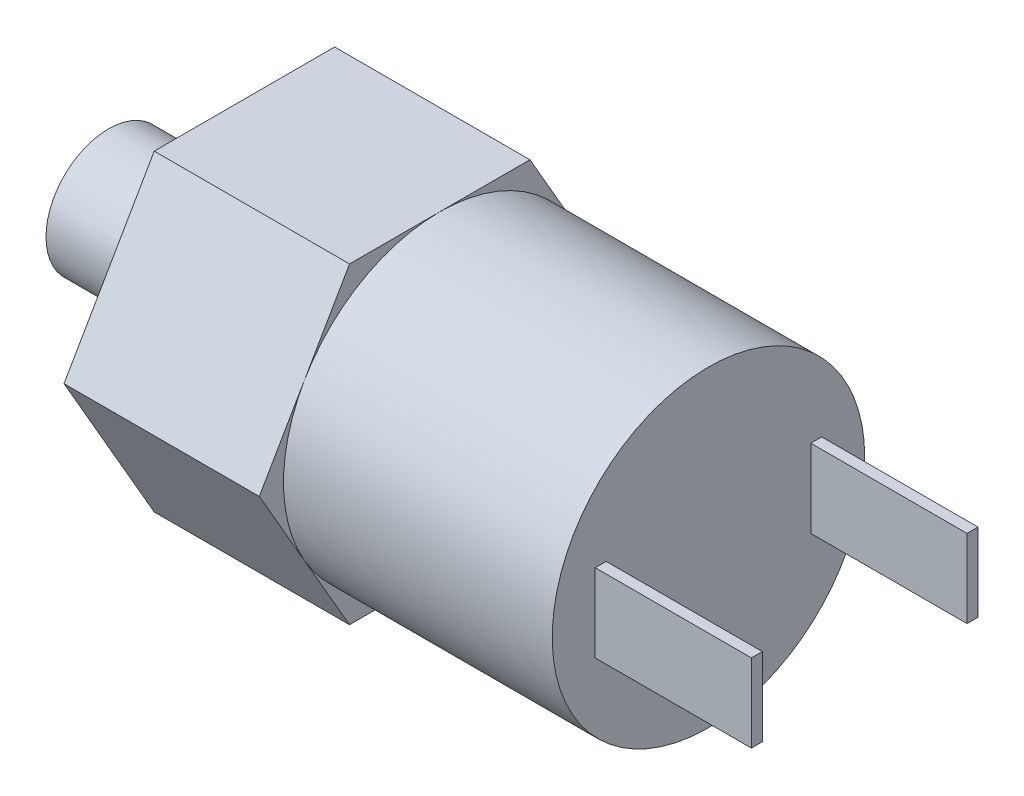
ISO-10303-21;
HEADER;
FILE_DESCRIPTION(('STEP AP214'),'2;1');
FILE_NAME('part.step','',(''),(''),'','','');
FILE_SCHEMA(('AUTOMOTIVE_DESIGN { 1 0 10303 214 1 1 1 1 }'));
ENDSEC;
DATA;
#1=APPLICATION_CONTEXT('core data for automotive mechanical design processes');
#2=APPLICATION_PROTOCOL_DEFINITION('international standard','automotive_design',2000,#1);
#3=PRODUCT_CONTEXT('',#1,'mechanical');
#4=PRODUCT('Part','Part','',(#3));
#5=PRODUCT_RELATED_PRODUCT_CATEGORY('part','',(#4));
#6=PRODUCT_DEFINITION_FORMATION('','',#4);
#7=PRODUCT_DEFINITION_CONTEXT('part definition',#1,'design');
#8=PRODUCT_DEFINITION('design','',#6,#7);
#9=PRODUCT_DEFINITION_SHAPE('','',#8);
#10=(LENGTH_UNIT() NAMED_UNIT(*) SI_UNIT(.MILLI.,.METRE.));
#11=(NAMED_UNIT(*) PLANE_ANGLE_UNIT() SI_UNIT($,.RADIAN.));
#12=(NAMED_UNIT(*) SI_UNIT($,.STERADIAN.) SOLID_ANGLE_UNIT());
#13=UNCERTAINTY_MEASURE_WITH_UNIT(LENGTH_MEASURE(1.E-05),#10,'distance_accuracy_value','');
#14=(GEOMETRIC_REPRESENTATION_CONTEXT(3) GLOBAL_UNCERTAINTY_ASSIGNED_CONTEXT((#13)) GLOBAL_UNIT_ASSIGNED_CONTEXT((#10,
#11,#12)) REPRESENTATION_CONTEXT('',''));
#15=CARTESIAN_POINT('',(0.,0.,0.));
#16=DIRECTION('',(0.,0.,1.));
#17=DIRECTION('',(1.,0.,0.));
#18=AXIS2_PLACEMENT_3D('',#15,#16,#17);
#19=CARTESIAN_POINT('',(37.719,0.,0.));
#20=DIRECTION('',(1.,0.,0.));
#21=DIRECTION('',(0.,0.,-1.));
#22=AXIS2_PLACEMENT_3D('',#19,#20,#21);
#23=PLANE('',#22);
#24=DIRECTION('',(0.,0.,1.));
#25=VECTOR('',#24,1.);
#26=CARTESIAN_POINT('',(37.719,3.17499999999999,-8.3185));
#27=LINE('',#26,#25);
#28=CARTESIAN_POINT('',(37.719,3.17499999999999,-9.2075));
#29=VERTEX_POINT('',#28);
#30=CARTESIAN_POINT('',(37.719,3.17499999999999,-8.3185));
#31=VERTEX_POINT('',#30);
#32=EDGE_CURVE('E184',#29,#31,#27,.T.);
#33=ORIENTED_EDGE('',*,*,#32,.F.);
#34=DIRECTION('',(0.,1.,0.));
#35=VECTOR('',#34,1.);
#36=CARTESIAN_POINT('',(37.719,3.17499999999999,-9.2075));
#37=LINE('',#36,#35);
#38=CARTESIAN_POINT('',(37.719,-3.17500000000001,-9.2075));
#39=VERTEX_POINT('',#38);
#40=EDGE_CURVE('E181',#39,#29,#37,.T.);
#41=ORIENTED_EDGE('',*,*,#40,.F.);
#42=DIRECTION('',(0.,0.,-1.));
#43=VECTOR('',#42,1.);
#44=CARTESIAN_POINT('',(37.719,-3.17500000000001,-8.3185));
#45=LINE('',#44,#43);
#46=CARTESIAN_POINT('',(37.719,-3.17500000000001,-8.3185));
#47=VERTEX_POINT('',#46);
#48=EDGE_CURVE('E193',#47,#39,#45,.T.);
#49=ORIENTED_EDGE('',*,*,#48,.F.);
#50=DIRECTION('',(0.,-1.,0.));
#51=VECTOR('',#50,1.);
#52=CARTESIAN_POINT('',(37.719,3.17499999999999,-8.3185));
#53=LINE('',#52,#51);
#54=EDGE_CURVE('E201',#31,#47,#53,.T.);
#55=ORIENTED_EDGE('',*,*,#54,.F.);
#56=EDGE_LOOP('',(#33,#41,#49,#55));
#57=FACE_BOUND('',#56,.T.);
#58=CARTESIAN_POINT('',(37.719,0.,0.));
#59=DIRECTION('',(1.,0.,0.));
#60=DIRECTION('',(0.,0.,-1.));
#61=AXIS2_PLACEMENT_3D('',#58,#59,#60);
#62=CIRCLE('',#61,12.7);
#63=CARTESIAN_POINT('',(37.719,0.,-12.7));
#64=VERTEX_POINT('',#63);
#65=EDGE_CURVE('E216',#64,#64,#62,.T.);
#66=ORIENTED_EDGE('',*,*,#65,.T.);
#67=EDGE_LOOP('',(#66));
#68=FACE_BOUND('',#67,.T.);
#69=DIRECTION('',(0.,0.,-1.));
#70=VECTOR('',#69,1.);
#71=CARTESIAN_POINT('',(37.719,-3.175,8.3185));
#72=LINE('',#71,#70);
#73=CARTESIAN_POINT('',(37.719,-3.175,9.2075));
#74=VERTEX_POINT('',#73);
#75=CARTESIAN_POINT('',(37.719,-3.175,8.3185));
#76=VERTEX_POINT('',#75);
#77=EDGE_CURVE('E369',#74,#76,#72,.T.);
#78=ORIENTED_EDGE('',*,*,#77,.F.);
#79=DIRECTION('',(0.,-1.,0.));
#80=VECTOR('',#79,1.);
#81=CARTESIAN_POINT('',(37.719,-3.175,9.2075));
#82=LINE('',#81,#80);
#83=CARTESIAN_POINT('',(37.719,3.175,9.2075));
#84=VERTEX_POINT('',#83);
#85=EDGE_CURVE('E179',#84,#74,#82,.T.);
#86=ORIENTED_EDGE('',*,*,#85,.F.);
#87=DIRECTION('',(0.,0.,1.));
#88=VECTOR('',#87,1.);
#89=CARTESIAN_POINT('',(37.719,3.175,8.3185));
#90=LINE('',#89,#88);
#91=CARTESIAN_POINT('',(37.719,3.175,8.3185));
#92=VERTEX_POINT('',#91);
#93=EDGE_CURVE('E175',#92,#84,#90,.T.);
#94=ORIENTED_EDGE('',*,*,#93,.F.);
#95=DIRECTION('',(0.,1.,0.));
#96=VECTOR('',#95,1.);
#97=CARTESIAN_POINT('',(37.719,-3.175,8.3185));
#98=LINE('',#97,#96);
#99=EDGE_CURVE('E371',#76,#92,#98,.T.);
#100=ORIENTED_EDGE('',*,*,#99,.F.);
#101=EDGE_LOOP('',(#78,#86,#94,#100));
#102=FACE_BOUND('',#101,.T.);
#103=ADVANCED_FACE('F36',(#57,#68,#102),#23,.T.);
#104=CARTESIAN_POINT('',(0.,0.,0.));
#105=DIRECTION('',(1.,0.,0.));
#106=DIRECTION('',(0.,0.,-1.));
#107=AXIS2_PLACEMENT_3D('',#104,#105,#106);
#108=PLANE('',#107);
#109=CARTESIAN_POINT('',(0.,0.,0.));
#110=DIRECTION('',(1.,0.,0.));
#111=DIRECTION('',(0.,0.,-1.));
#112=AXIS2_PLACEMENT_3D('',#109,#110,#111);
#113=CIRCLE('',#112,6.985);
#114=CARTESIAN_POINT('',(0.,0.,-6.985));
#115=VERTEX_POINT('',#114);
#116=EDGE_CURVE('E11',#115,#115,#113,.T.);
#117=ORIENTED_EDGE('',*,*,#116,.T.);
#118=EDGE_LOOP('',(#117));
#119=FACE_BOUND('',#118,.T.);
#120=DIRECTION('',(0.,0.866025403784439,-0.5));
#121=VECTOR('',#120,1.);
#122=CARTESIAN_POINT('',(0.,-12.7,-7.33234841870825));
#123=LINE('',#122,#121);
#124=CARTESIAN_POINT('',(0.,-12.7,-7.33234841870825));
#125=VERTEX_POINT('',#124);
#126=CARTESIAN_POINT('',(0.,0.,-14.6646968374165));
#127=VERTEX_POINT('',#126);
#128=EDGE_CURVE('E219',#125,#127,#123,.T.);
#129=ORIENTED_EDGE('',*,*,#128,.F.);
#130=DIRECTION('',(0.,0.,-1.));
#131=VECTOR('',#130,1.);
#132=CARTESIAN_POINT('',(0.,-12.7,7.33234841870826));
#133=LINE('',#132,#131);
#134=CARTESIAN_POINT('',(0.,-12.7,7.33234841870826));
#135=VERTEX_POINT('',#134);
#136=EDGE_CURVE('E258',#135,#125,#133,.T.);
#137=ORIENTED_EDGE('',*,*,#136,.F.);
#138=DIRECTION('',(0.,-0.866025403784439,-0.5));
#139=VECTOR('',#138,1.);
#140=CARTESIAN_POINT('',(0.,0.,14.6646968374165));
#141=LINE('',#140,#139);
#142=CARTESIAN_POINT('',(0.,0.,14.6646968374165));
#143=VERTEX_POINT('',#142);
#144=EDGE_CURVE('E256',#143,#135,#141,.T.);
#145=ORIENTED_EDGE('',*,*,#144,.F.);
#146=DIRECTION('',(0.,-0.866025403784439,0.5));
#147=VECTOR('',#146,1.);
#148=CARTESIAN_POINT('',(0.,12.7,7.33234841870825));
#149=LINE('',#148,#147);
#150=CARTESIAN_POINT('',(0.,12.7,7.33234841870825));
#151=VERTEX_POINT('',#150);
#152=EDGE_CURVE('E254',#151,#143,#149,.T.);
#153=ORIENTED_EDGE('',*,*,#152,.F.);
#154=DIRECTION('',(0.,0.,1.));
#155=VECTOR('',#154,1.);
#156=CARTESIAN_POINT('',(0.,12.7,-7.33234841870825));
#157=LINE('',#156,#155);
#158=CARTESIAN_POINT('',(0.,12.7,-7.33234841870825));
#159=VERTEX_POINT('',#158);
#160=EDGE_CURVE('E252',#159,#151,#157,.T.);
#161=ORIENTED_EDGE('',*,*,#160,.F.);
#162=DIRECTION('',(0.,0.866025403784439,0.5));
#163=VECTOR('',#162,1.);
#164=CARTESIAN_POINT('',(0.,0.,-14.6646968374165));
#165=LINE('',#164,#163);
#166=EDGE_CURVE('E250',#127,#159,#165,.T.);
#167=ORIENTED_EDGE('',*,*,#166,.F.);
#168=EDGE_LOOP('',(#129,#137,#145,#153,#161,#167));
#169=FACE_BOUND('',#168,.T.);
#170=ADVANCED_FACE('F309',(#119,#169),#108,.F.);
#171=CARTESIAN_POINT('',(15.875,0.,0.));
#172=DIRECTION('',(1.,0.,0.));
#173=DIRECTION('',(0.,0.,-1.));
#174=AXIS2_PLACEMENT_3D('',#171,#172,#173);
#175=PLANE('',#174);
#176=CARTESIAN_POINT('',(15.875,0.,0.));
#177=DIRECTION('',(1.,0.,0.));
#178=DIRECTION('',(0.,0.,-1.));
#179=AXIS2_PLACEMENT_3D('',#176,#177,#178);
#180=CIRCLE('',#179,12.7);
#181=CARTESIAN_POINT('',(15.875,6.35,-10.9985226280624));
#182=VERTEX_POINT('',#181);
#183=CARTESIAN_POINT('',(15.875,12.7,0.));
#184=VERTEX_POINT('',#183);
#185=EDGE_CURVE('E215',#182,#184,#180,.T.);
#186=ORIENTED_EDGE('',*,*,#185,.F.);
#187=DIRECTION('',(0.,0.866025403784439,0.5));
#188=VECTOR('',#187,1.);
#189=CARTESIAN_POINT('',(15.875,0.,-14.6646968374165));
#190=LINE('',#189,#188);
#191=CARTESIAN_POINT('',(15.875,12.7,-7.33234841870825));
#192=VERTEX_POINT('',#191);
#193=EDGE_CURVE('E227',#182,#192,#190,.T.);
#194=ORIENTED_EDGE('',*,*,#193,.T.);
#195=DIRECTION('',(0.,0.,1.));
#196=VECTOR('',#195,1.);
#197=CARTESIAN_POINT('',(15.875,12.7,-7.33234841870825));
#198=LINE('',#197,#196);
#199=EDGE_CURVE('E232',#192,#184,#198,.T.);
#200=ORIENTED_EDGE('',*,*,#199,.T.);
#201=EDGE_LOOP('',(#186,#194,#200));
#202=FACE_BOUND('',#201,.T.);
#203=ADVANCED_FACE('F318',(#202),#175,.T.);
#204=CARTESIAN_POINT('',(15.875,6.35,10.9985226280624));
#205=VERTEX_POINT('',#204);
#206=EDGE_CURVE('E222',#184,#205,#180,.T.);
#207=ORIENTED_EDGE('',*,*,#206,.F.);
#208=CARTESIAN_POINT('',(15.875,12.7,7.33234841870825));
#209=VERTEX_POINT('',#208);
#210=EDGE_CURVE('E231',#184,#209,#198,.T.);
#211=ORIENTED_EDGE('',*,*,#210,.T.);
#212=DIRECTION('',(0.,-0.866025403784439,0.5));
#213=VECTOR('',#212,1.);
#214=CARTESIAN_POINT('',(15.875,12.7,7.33234841870825));
#215=LINE('',#214,#213);
#216=EDGE_CURVE('E236',#209,#205,#215,.T.);
#217=ORIENTED_EDGE('',*,*,#216,.T.);
#218=EDGE_LOOP('',(#207,#211,#217));
#219=FACE_BOUND('',#218,.T.);
#220=ADVANCED_FACE('F325',(#219),#175,.T.);
#221=CARTESIAN_POINT('',(15.875,-6.35,10.9985226280624));
#222=VERTEX_POINT('',#221);
#223=EDGE_CURVE('E280',#205,#222,#180,.T.);
#224=ORIENTED_EDGE('',*,*,#223,.F.);
#225=CARTESIAN_POINT('',(15.875,0.,14.6646968374165));
#226=VERTEX_POINT('',#225);
#227=EDGE_CURVE('E235',#205,#226,#215,.T.);
#228=ORIENTED_EDGE('',*,*,#227,.T.);
#229=DIRECTION('',(0.,-0.866025403784439,-0.5));
#230=VECTOR('',#229,1.);
#231=CARTESIAN_POINT('',(15.875,0.,14.6646968374165));
#232=LINE('',#231,#230);
#233=EDGE_CURVE('E240',#226,#222,#232,.T.);
#234=ORIENTED_EDGE('',*,*,#233,.T.);
#235=EDGE_LOOP('',(#224,#228,#234));
#236=FACE_BOUND('',#235,.T.);
#237=ADVANCED_FACE('F332',(#236),#175,.T.);
#238=CARTESIAN_POINT('',(15.875,-12.7,0.));
#239=VERTEX_POINT('',#238);
#240=EDGE_CURVE('E283',#222,#239,#180,.T.);
#241=ORIENTED_EDGE('',*,*,#240,.F.);
#242=CARTESIAN_POINT('',(15.875,-12.7,7.33234841870826));
#243=VERTEX_POINT('',#242);
#244=EDGE_CURVE('E239',#222,#243,#232,.T.);
#245=ORIENTED_EDGE('',*,*,#244,.T.);
#246=DIRECTION('',(0.,0.,-1.));
#247=VECTOR('',#246,1.);
#248=CARTESIAN_POINT('',(15.875,-12.7,7.33234841870826));
#249=LINE('',#248,#247);
#250=EDGE_CURVE('E244',#243,#239,#249,.T.);
#251=ORIENTED_EDGE('',*,*,#250,.T.);
#252=EDGE_LOOP('',(#241,#245,#251));
#253=FACE_BOUND('',#252,.T.);
#254=ADVANCED_FACE('F338',(#253),#175,.T.);
#255=CARTESIAN_POINT('',(15.875,-6.35,-10.9985226280624));
#256=VERTEX_POINT('',#255);
#257=EDGE_CURVE('E285',#239,#256,#180,.T.);
#258=ORIENTED_EDGE('',*,*,#257,.F.);
#259=CARTESIAN_POINT('',(15.875,-12.7,-7.33234841870825));
#260=VERTEX_POINT('',#259);
#261=EDGE_CURVE('E243',#239,#260,#249,.T.);
#262=ORIENTED_EDGE('',*,*,#261,.T.);
#263=DIRECTION('',(0.,0.866025403784439,-0.5));
#264=VECTOR('',#263,1.);
#265=CARTESIAN_POINT('',(15.875,-12.7,-7.33234841870825));
#266=LINE('',#265,#264);
#267=EDGE_CURVE('E224',#260,#256,#266,.T.);
#268=ORIENTED_EDGE('',*,*,#267,.T.);
#269=EDGE_LOOP('',(#258,#262,#268));
#270=FACE_BOUND('',#269,.T.);
#271=ADVANCED_FACE('F300',(#270),#175,.T.);
#272=CARTESIAN_POINT('',(15.875,-12.7,-7.33234841870825));
#273=DIRECTION('',(0.,0.5,0.866025403784439));
#274=DIRECTION('',(0.,-0.866025403784439,0.5));
#275=AXIS2_PLACEMENT_3D('',#272,#273,#274);
#276=PLANE('',#275);
#277=ORIENTED_EDGE('',*,*,#128,.T.);
#278=DIRECTION('',(-1.,0.,0.));
#279=VECTOR('',#278,1.);
#280=CARTESIAN_POINT('',(15.875,0.,-14.6646968374165));
#281=LINE('',#280,#279);
#282=CARTESIAN_POINT('',(15.875,0.,-14.6646968374165));
#283=VERTEX_POINT('',#282);
#284=EDGE_CURVE('E274',#283,#127,#281,.T.);
#285=ORIENTED_EDGE('',*,*,#284,.F.);
#286=EDGE_CURVE('E228',#256,#283,#266,.T.);
#287=ORIENTED_EDGE('',*,*,#286,.F.);
#288=ORIENTED_EDGE('',*,*,#267,.F.);
#289=DIRECTION('',(-1.,0.,0.));
#290=VECTOR('',#289,1.);
#291=CARTESIAN_POINT('',(15.875,-12.7,-7.33234841870825));
#292=LINE('',#291,#290);
#293=EDGE_CURVE('E247',#260,#125,#292,.T.);
#294=ORIENTED_EDGE('',*,*,#293,.T.);
#295=EDGE_LOOP('',(#277,#285,#287,#288,#294));
#296=FACE_BOUND('',#295,.T.);
#297=ADVANCED_FACE('F298',(#296),#276,.F.);
#298=CARTESIAN_POINT('',(15.875,0.,-14.6646968374165));
#299=DIRECTION('',(0.,-0.5,0.866025403784439));
#300=DIRECTION('',(0.,-0.866025403784439,-0.5));
#301=AXIS2_PLACEMENT_3D('',#298,#299,#300);
#302=PLANE('',#301);
#303=ORIENTED_EDGE('',*,*,#166,.T.);
#304=DIRECTION('',(-1.,0.,0.));
#305=VECTOR('',#304,1.);
#306=CARTESIAN_POINT('',(15.875,12.7,-7.33234841870825));
#307=LINE('',#306,#305);
#308=EDGE_CURVE('E271',#192,#159,#307,.T.);
#309=ORIENTED_EDGE('',*,*,#308,.F.);
#310=ORIENTED_EDGE('',*,*,#193,.F.);
#311=EDGE_CURVE('E229',#283,#182,#190,.T.);
#312=ORIENTED_EDGE('',*,*,#311,.F.);
#313=ORIENTED_EDGE('',*,*,#284,.T.);
#314=EDGE_LOOP('',(#303,#309,#310,#312,#313));
#315=FACE_BOUND('',#314,.T.);
#316=ADVANCED_FACE('F315',(#315),#302,.F.);
#317=CARTESIAN_POINT('',(15.875,12.7,-7.33234841870825));
#318=DIRECTION('',(0.,-1.,0.));
#319=DIRECTION('',(0.,0.,-1.));
#320=AXIS2_PLACEMENT_3D('',#317,#318,#319);
#321=PLANE('',#320);
#322=ORIENTED_EDGE('',*,*,#160,.T.);
#323=DIRECTION('',(-1.,0.,0.));
#324=VECTOR('',#323,1.);
#325=CARTESIAN_POINT('',(15.875,12.7,7.33234841870825));
#326=LINE('',#325,#324);
#327=EDGE_CURVE('E268',#209,#151,#326,.T.);
#328=ORIENTED_EDGE('',*,*,#327,.F.);
#329=ORIENTED_EDGE('',*,*,#210,.F.);
#330=ORIENTED_EDGE('',*,*,#199,.F.);
#331=ORIENTED_EDGE('',*,*,#308,.T.);
#332=EDGE_LOOP('',(#322,#328,#329,#330,#331));
#333=FACE_BOUND('',#332,.T.);
#334=ADVANCED_FACE('F321',(#333),#321,.F.);
#335=CARTESIAN_POINT('',(15.875,12.7,7.33234841870825));
#336=DIRECTION('',(0.,-0.5,-0.866025403784439));
#337=DIRECTION('',(0.,0.866025403784439,-0.5));
#338=AXIS2_PLACEMENT_3D('',#335,#336,#337);
#339=PLANE('',#338);
#340=ORIENTED_EDGE('',*,*,#152,.T.);
#341=DIRECTION('',(-1.,0.,0.));
#342=VECTOR('',#341,1.);
#343=CARTESIAN_POINT('',(15.875,0.,14.6646968374165));
#344=LINE('',#343,#342);
#345=EDGE_CURVE('E265',#226,#143,#344,.T.);
#346=ORIENTED_EDGE('',*,*,#345,.F.);
#347=ORIENTED_EDGE('',*,*,#227,.F.);
#348=ORIENTED_EDGE('',*,*,#216,.F.);
#349=ORIENTED_EDGE('',*,*,#327,.T.);
#350=EDGE_LOOP('',(#340,#346,#347,#348,#349));
#351=FACE_BOUND('',#350,.T.);
#352=ADVANCED_FACE('F328',(#351),#339,.F.);
#353=CARTESIAN_POINT('',(15.875,0.,14.6646968374165));
#354=DIRECTION('',(0.,0.5,-0.866025403784439));
#355=DIRECTION('',(0.,0.866025403784439,0.5));
#356=AXIS2_PLACEMENT_3D('',#353,#354,#355);
#357=PLANE('',#356);
#358=ORIENTED_EDGE('',*,*,#144,.T.);
#359=DIRECTION('',(-1.,0.,0.));
#360=VECTOR('',#359,1.);
#361=CARTESIAN_POINT('',(15.875,-12.7,7.33234841870826));
#362=LINE('',#361,#360);
#363=EDGE_CURVE('E262',#243,#135,#362,.T.);
#364=ORIENTED_EDGE('',*,*,#363,.F.);
#365=ORIENTED_EDGE('',*,*,#244,.F.);
#366=ORIENTED_EDGE('',*,*,#233,.F.);
#367=ORIENTED_EDGE('',*,*,#345,.T.);
#368=EDGE_LOOP('',(#358,#364,#365,#366,#367));
#369=FACE_BOUND('',#368,.T.);
#370=ADVANCED_FACE('F335',(#369),#357,.F.);
#371=CARTESIAN_POINT('',(15.875,-12.7,7.33234841870826));
#372=DIRECTION('',(0.,1.,0.));
#373=DIRECTION('',(0.,0.,1.));
#374=AXIS2_PLACEMENT_3D('',#371,#372,#373);
#375=PLANE('',#374);
#376=ORIENTED_EDGE('',*,*,#136,.T.);
#377=ORIENTED_EDGE('',*,*,#293,.F.);
#378=ORIENTED_EDGE('',*,*,#261,.F.);
#379=ORIENTED_EDGE('',*,*,#250,.F.);
#380=ORIENTED_EDGE('',*,*,#363,.T.);
#381=EDGE_LOOP('',(#376,#377,#378,#379,#380));
#382=FACE_BOUND('',#381,.T.);
#383=ADVANCED_FACE('F305',(#382),#375,.F.);
#384=EDGE_CURVE('E223',#256,#182,#180,.T.);
#385=ORIENTED_EDGE('',*,*,#384,.F.);
#386=ORIENTED_EDGE('',*,*,#286,.T.);
#387=ORIENTED_EDGE('',*,*,#311,.T.);
#388=EDGE_LOOP('',(#385,#386,#387));
#389=FACE_BOUND('',#388,.T.);
#390=ADVANCED_FACE('F292',(#389),#175,.T.);
#391=CARTESIAN_POINT('',(37.719,0.,0.));
#392=DIRECTION('',(-1.,0.,0.));
#393=DIRECTION('',(0.,0.,1.));
#394=AXIS2_PLACEMENT_3D('',#391,#392,#393);
#395=CYLINDRICAL_SURFACE('',#394,12.7);
#396=ORIENTED_EDGE('',*,*,#65,.F.);
#397=EDGE_LOOP('',(#396));
#398=FACE_BOUND('',#397,.T.);
#399=ORIENTED_EDGE('',*,*,#185,.T.);
#400=ORIENTED_EDGE('',*,*,#206,.T.);
#401=ORIENTED_EDGE('',*,*,#223,.T.);
#402=ORIENTED_EDGE('',*,*,#240,.T.);
#403=ORIENTED_EDGE('',*,*,#257,.T.);
#404=ORIENTED_EDGE('',*,*,#384,.T.);
#405=EDGE_LOOP('',(#399,#400,#401,#402,#403,#404));
#406=FACE_BOUND('',#405,.T.);
#407=ADVANCED_FACE('F288',(#398,#406),#395,.T.);
#408=CARTESIAN_POINT('',(-11.049,0.,0.));
#409=DIRECTION('',(1.,0.,0.));
#410=DIRECTION('',(0.,0.,-1.));
#411=AXIS2_PLACEMENT_3D('',#408,#409,#410);
#412=CYLINDRICAL_SURFACE('',#411,5.08);
#413=CARTESIAN_POINT('',(-1.905,0.,0.));
#414=DIRECTION('',(1.,0.,0.));
#415=DIRECTION('',(0.,0.,-1.));
#416=AXIS2_PLACEMENT_3D('',#413,#414,#415);
#417=CIRCLE('',#416,5.08);
#418=CARTESIAN_POINT('',(-1.905,0.,-5.08));
#419=VERTEX_POINT('',#418);
#420=EDGE_CURVE('E44',#419,#419,#417,.F.);
#421=ORIENTED_EDGE('',*,*,#420,.T.);
#422=EDGE_LOOP('',(#421));
#423=FACE_BOUND('',#422,.T.);
#424=CARTESIAN_POINT('',(-11.049,0.,0.));
#425=DIRECTION('',(-1.,0.,0.));
#426=DIRECTION('',(0.,0.,1.));
#427=AXIS2_PLACEMENT_3D('',#424,#425,#426);
#428=CIRCLE('',#427,5.08);
#429=CARTESIAN_POINT('',(-11.049,0.,5.08));
#430=VERTEX_POINT('',#429);
#431=EDGE_CURVE('E212',#430,#430,#428,.T.);
#432=ORIENTED_EDGE('',*,*,#431,.F.);
#433=EDGE_LOOP('',(#432));
#434=FACE_BOUND('',#433,.T.);
#435=ADVANCED_FACE('F357',(#423,#434),#412,.T.);
#436=CARTESIAN_POINT('',(-11.049,0.,0.));
#437=DIRECTION('',(-1.,0.,0.));
#438=DIRECTION('',(0.,0.,1.));
#439=AXIS2_PLACEMENT_3D('',#436,#437,#438);
#440=PLANE('',#439);
#441=ORIENTED_EDGE('',*,*,#431,.T.);
#442=EDGE_LOOP('',(#441));
#443=FACE_BOUND('',#442,.T.);
#444=ADVANCED_FACE('F365',(#443),#440,.T.);
#445=CARTESIAN_POINT('',(-1.905,0.,0.));
#446=DIRECTION('',(1.,0.,0.));
#447=DIRECTION('',(0.,0.,-1.));
#448=AXIS2_PLACEMENT_3D('',#445,#446,#447);
#449=TOROIDAL_SURFACE('',#448,6.985,1.905);
#450=ORIENTED_EDGE('',*,*,#116,.F.);
#451=EDGE_LOOP('',(#450));
#452=FACE_BOUND('',#451,.T.);
#453=ORIENTED_EDGE('',*,*,#420,.F.);
#454=EDGE_LOOP('',(#453));
#455=FACE_BOUND('',#454,.T.);
#456=ADVANCED_FACE('F38',(#452,#455),#449,.F.);
#457=CARTESIAN_POINT('',(50.419,3.17499999999999,-9.2075));
#458=DIRECTION('',(0.,0.,1.));
#459=DIRECTION('',(1.,0.,0.));
#460=AXIS2_PLACEMENT_3D('',#457,#458,#459);
#461=PLANE('',#460);
#462=ORIENTED_EDGE('',*,*,#40,.T.);
#463=DIRECTION('',(-1.,0.,0.));
#464=VECTOR('',#463,1.);
#465=CARTESIAN_POINT('',(50.419,3.17499999999999,-9.2075));
#466=LINE('',#465,#464);
#467=CARTESIAN_POINT('',(50.419,3.17499999999999,-9.2075));
#468=VERTEX_POINT('',#467);
#469=EDGE_CURVE('E210',#468,#29,#466,.T.);
#470=ORIENTED_EDGE('',*,*,#469,.F.);
#471=DIRECTION('',(0.,1.,0.));
#472=VECTOR('',#471,1.);
#473=CARTESIAN_POINT('',(50.419,3.17499999999999,-9.2075));
#474=LINE('',#473,#472);
#475=CARTESIAN_POINT('',(50.419,-3.17500000000001,-9.2075));
#476=VERTEX_POINT('',#475);
#477=EDGE_CURVE('E189',#476,#468,#474,.T.);
#478=ORIENTED_EDGE('',*,*,#477,.F.);
#479=DIRECTION('',(-1.,0.,0.));
#480=VECTOR('',#479,1.);
#481=CARTESIAN_POINT('',(50.419,-3.17500000000001,-9.2075));
#482=LINE('',#481,#480);
#483=EDGE_CURVE('E198',#476,#39,#482,.T.);
#484=ORIENTED_EDGE('',*,*,#483,.T.);
#485=EDGE_LOOP('',(#462,#470,#478,#484));
#486=FACE_BOUND('',#485,.T.);
#487=ADVANCED_FACE('F410',(#486),#461,.F.);
#488=CARTESIAN_POINT('',(50.419,3.17499999999999,-8.3185));
#489=DIRECTION('',(0.,-1.,0.));
#490=DIRECTION('',(0.,0.,-1.));
#491=AXIS2_PLACEMENT_3D('',#488,#489,#490);
#492=PLANE('',#491);
#493=ORIENTED_EDGE('',*,*,#32,.T.);
#494=DIRECTION('',(-1.,0.,0.));
#495=VECTOR('',#494,1.);
#496=CARTESIAN_POINT('',(50.419,3.17499999999999,-8.3185));
#497=LINE('',#496,#495);
#498=CARTESIAN_POINT('',(50.419,3.17499999999999,-8.3185));
#499=VERTEX_POINT('',#498);
#500=EDGE_CURVE('E207',#499,#31,#497,.T.);
#501=ORIENTED_EDGE('',*,*,#500,.F.);
#502=DIRECTION('',(0.,0.,1.));
#503=VECTOR('',#502,1.);
#504=CARTESIAN_POINT('',(50.419,3.17499999999999,-8.3185));
#505=LINE('',#504,#503);
#506=EDGE_CURVE('E192',#468,#499,#505,.T.);
#507=ORIENTED_EDGE('',*,*,#506,.F.);
#508=ORIENTED_EDGE('',*,*,#469,.T.);
#509=EDGE_LOOP('',(#493,#501,#507,#508));
#510=FACE_BOUND('',#509,.T.);
#511=ADVANCED_FACE('F406',(#510),#492,.F.);
#512=CARTESIAN_POINT('',(50.419,3.17499999999999,-8.3185));
#513=DIRECTION('',(0.,0.,-1.));
#514=DIRECTION('',(-1.,0.,0.));
#515=AXIS2_PLACEMENT_3D('',#512,#513,#514);
#516=PLANE('',#515);
#517=ORIENTED_EDGE('',*,*,#54,.T.);
#518=DIRECTION('',(-1.,0.,0.));
#519=VECTOR('',#518,1.);
#520=CARTESIAN_POINT('',(50.419,-3.17500000000001,-8.3185));
#521=LINE('',#520,#519);
#522=CARTESIAN_POINT('',(50.419,-3.17500000000001,-8.3185));
#523=VERTEX_POINT('',#522);
#524=EDGE_CURVE('E59',#523,#47,#521,.T.);
#525=ORIENTED_EDGE('',*,*,#524,.F.);
#526=DIRECTION('',(0.,-1.,0.));
#527=VECTOR('',#526,1.);
#528=CARTESIAN_POINT('',(50.419,3.17499999999999,-8.3185));
#529=LINE('',#528,#527);
#530=EDGE_CURVE('E195',#499,#523,#529,.T.);
#531=ORIENTED_EDGE('',*,*,#530,.F.);
#532=ORIENTED_EDGE('',*,*,#500,.T.);
#533=EDGE_LOOP('',(#517,#525,#531,#532));
#534=FACE_BOUND('',#533,.T.);
#535=ADVANCED_FACE('F403',(#534),#516,.F.);
#536=CARTESIAN_POINT('',(50.419,-3.17500000000001,-8.3185));
#537=DIRECTION('',(0.,1.,0.));
#538=DIRECTION('',(0.,0.,1.));
#539=AXIS2_PLACEMENT_3D('',#536,#537,#538);
#540=PLANE('',#539);
#541=ORIENTED_EDGE('',*,*,#48,.T.);
#542=ORIENTED_EDGE('',*,*,#483,.F.);
#543=DIRECTION('',(0.,0.,-1.));
#544=VECTOR('',#543,1.);
#545=CARTESIAN_POINT('',(50.419,-3.17500000000001,-8.3185));
#546=LINE('',#545,#544);
#547=EDGE_CURVE('E197',#523,#476,#546,.T.);
#548=ORIENTED_EDGE('',*,*,#547,.F.);
#549=ORIENTED_EDGE('',*,*,#524,.T.);
#550=EDGE_LOOP('',(#541,#542,#548,#549));
#551=FACE_BOUND('',#550,.T.);
#552=ADVANCED_FACE('F399',(#551),#540,.F.);
#553=CARTESIAN_POINT('',(50.419,0.,0.));
#554=DIRECTION('',(1.,0.,0.));
#555=DIRECTION('',(0.,0.,-1.));
#556=AXIS2_PLACEMENT_3D('',#553,#554,#555);
#557=PLANE('',#556);
#558=ORIENTED_EDGE('',*,*,#477,.T.);
#559=ORIENTED_EDGE('',*,*,#506,.T.);
#560=ORIENTED_EDGE('',*,*,#530,.T.);
#561=ORIENTED_EDGE('',*,*,#547,.T.);
#562=EDGE_LOOP('',(#558,#559,#560,#561));
#563=FACE_BOUND('',#562,.T.);
#564=ADVANCED_FACE('F396',(#563),#557,.T.);
#565=CARTESIAN_POINT('',(50.419,-3.175,9.2075));
#566=DIRECTION('',(0.,0.,-1.));
#567=DIRECTION('',(-1.,0.,0.));
#568=AXIS2_PLACEMENT_3D('',#565,#566,#567);
#569=PLANE('',#568);
#570=ORIENTED_EDGE('',*,*,#85,.T.);
#571=DIRECTION('',(-1.,0.,0.));
#572=VECTOR('',#571,1.);
#573=CARTESIAN_POINT('',(50.419,-3.175,9.2075));
#574=LINE('',#573,#572);
#575=CARTESIAN_POINT('',(50.419,-3.175,9.2075));
#576=VERTEX_POINT('',#575);
#577=EDGE_CURVE('E160',#576,#74,#574,.T.);
#578=ORIENTED_EDGE('',*,*,#577,.F.);
#579=DIRECTION('',(0.,-1.,0.));
#580=VECTOR('',#579,1.);
#581=CARTESIAN_POINT('',(50.419,-3.175,9.2075));
#582=LINE('',#581,#580);
#583=CARTESIAN_POINT('',(50.419,3.175,9.2075));
#584=VERTEX_POINT('',#583);
#585=EDGE_CURVE('E167',#584,#576,#582,.T.);
#586=ORIENTED_EDGE('',*,*,#585,.F.);
#587=DIRECTION('',(-1.,0.,0.));
#588=VECTOR('',#587,1.);
#589=CARTESIAN_POINT('',(50.419,3.175,9.2075));
#590=LINE('',#589,#588);
#591=EDGE_CURVE('E378',#584,#84,#590,.T.);
#592=ORIENTED_EDGE('',*,*,#591,.T.);
#593=EDGE_LOOP('',(#570,#578,#586,#592));
#594=FACE_BOUND('',#593,.T.);
#595=ADVANCED_FACE('F177',(#594),#569,.F.);
#596=CARTESIAN_POINT('',(50.419,-3.175,8.3185));
#597=DIRECTION('',(0.,1.,0.));
#598=DIRECTION('',(0.,0.,1.));
#599=AXIS2_PLACEMENT_3D('',#596,#597,#598);
#600=PLANE('',#599);
#601=ORIENTED_EDGE('',*,*,#77,.T.);
#602=DIRECTION('',(-1.,0.,0.));
#603=VECTOR('',#602,1.);
#604=CARTESIAN_POINT('',(50.419,-3.175,8.3185));
#605=LINE('',#604,#603);
#606=CARTESIAN_POINT('',(50.419,-3.175,8.3185));
#607=VERTEX_POINT('',#606);
#608=EDGE_CURVE('E163',#607,#76,#605,.T.);
#609=ORIENTED_EDGE('',*,*,#608,.F.);
#610=DIRECTION('',(0.,0.,-1.));
#611=VECTOR('',#610,1.);
#612=CARTESIAN_POINT('',(50.419,-3.175,8.3185));
#613=LINE('',#612,#611);
#614=EDGE_CURVE('E156',#576,#607,#613,.T.);
#615=ORIENTED_EDGE('',*,*,#614,.F.);
#616=ORIENTED_EDGE('',*,*,#577,.T.);
#617=EDGE_LOOP('',(#601,#609,#615,#616));
#618=FACE_BOUND('',#617,.T.);
#619=ADVANCED_FACE('F158',(#618),#600,.F.);
#620=CARTESIAN_POINT('',(50.419,-3.175,8.3185));
#621=DIRECTION('',(0.,0.,1.));
#622=DIRECTION('',(1.,0.,0.));
#623=AXIS2_PLACEMENT_3D('',#620,#621,#622);
#624=PLANE('',#623);
#625=ORIENTED_EDGE('',*,*,#99,.T.);
#626=DIRECTION('',(-1.,0.,0.));
#627=VECTOR('',#626,1.);
#628=CARTESIAN_POINT('',(50.419,3.175,8.3185));
#629=LINE('',#628,#627);
#630=CARTESIAN_POINT('',(50.419,3.175,8.3185));
#631=VERTEX_POINT('',#630);
#632=EDGE_CURVE('E51',#631,#92,#629,.T.);
#633=ORIENTED_EDGE('',*,*,#632,.F.);
#634=DIRECTION('',(0.,1.,0.));
#635=VECTOR('',#634,1.);
#636=CARTESIAN_POINT('',(50.419,-3.175,8.3185));
#637=LINE('',#636,#635);
#638=EDGE_CURVE('E166',#607,#631,#637,.T.);
#639=ORIENTED_EDGE('',*,*,#638,.F.);
#640=ORIENTED_EDGE('',*,*,#608,.T.);
#641=EDGE_LOOP('',(#625,#633,#639,#640));
#642=FACE_BOUND('',#641,.T.);
#643=ADVANCED_FACE('F381',(#642),#624,.F.);
#644=CARTESIAN_POINT('',(50.419,3.175,8.3185));
#645=DIRECTION('',(0.,-1.,0.));
#646=DIRECTION('',(0.,0.,-1.));
#647=AXIS2_PLACEMENT_3D('',#644,#645,#646);
#648=PLANE('',#647);
#649=ORIENTED_EDGE('',*,*,#93,.T.);
#650=ORIENTED_EDGE('',*,*,#591,.F.);
#651=DIRECTION('',(0.,0.,1.));
#652=VECTOR('',#651,1.);
#653=CARTESIAN_POINT('',(50.419,3.175,8.3185));
#654=LINE('',#653,#652);
#655=EDGE_CURVE('E171',#631,#584,#654,.T.);
#656=ORIENTED_EDGE('',*,*,#655,.F.);
#657=ORIENTED_EDGE('',*,*,#632,.T.);
#658=EDGE_LOOP('',(#649,#650,#656,#657));
#659=FACE_BOUND('',#658,.T.);
#660=ADVANCED_FACE('F382',(#659),#648,.F.);
#661=CARTESIAN_POINT('',(50.419,0.,0.));
#662=DIRECTION('',(1.,0.,0.));
#663=DIRECTION('',(0.,0.,-1.));
#664=AXIS2_PLACEMENT_3D('',#661,#662,#663);
#665=PLANE('',#664);
#666=ORIENTED_EDGE('',*,*,#585,.T.);
#667=ORIENTED_EDGE('',*,*,#614,.T.);
#668=ORIENTED_EDGE('',*,*,#638,.T.);
#669=ORIENTED_EDGE('',*,*,#655,.T.);
#670=EDGE_LOOP('',(#666,#667,#668,#669));
#671=FACE_BOUND('',#670,.T.);
#672=ADVANCED_FACE('F170',(#671),#665,.T.);
#673=CLOSED_SHELL('',(#103,#170,#203,#220,#237,#254,#271,#297,#316,#334,#352,#370,#383,#390,
#407,#435,#444,#456,#487,#511,#535,#552,#564,#595,#619,#643,#660,#672));
#674=MANIFOLD_SOLID_BREP('B2',#673);
#675=ADVANCED_BREP_SHAPE_REPRESENTATION('',(#18,#674),#14);
#676=SHAPE_DEFINITION_REPRESENTATION(#9,#675);
ENDSEC;
END-ISO-10303-21;
